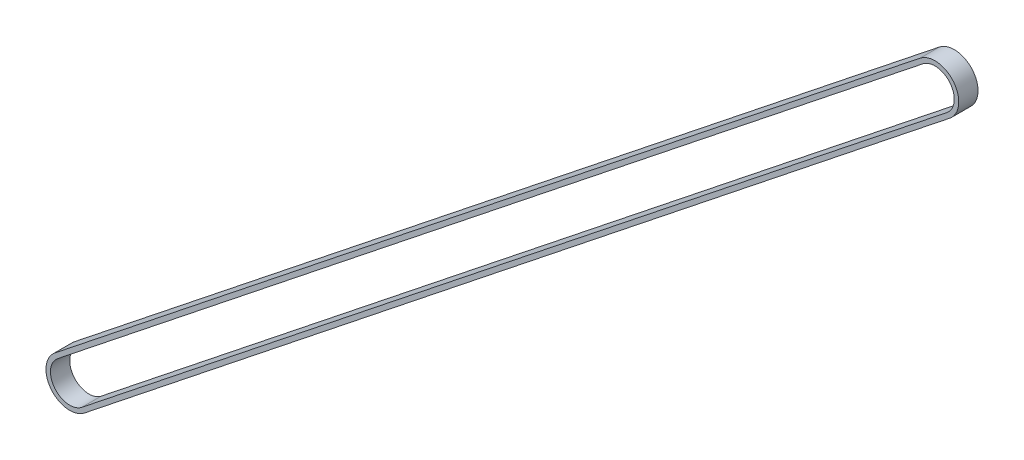
ISO-10303-21;
HEADER;
FILE_DESCRIPTION(('STEP AP214'),'2;1');
FILE_NAME('part.step','',(''),(''),'','','');
FILE_SCHEMA(('AUTOMOTIVE_DESIGN { 1 0 10303 214 1 1 1 1 }'));
ENDSEC;
DATA;
#1=APPLICATION_CONTEXT('core data for automotive mechanical design processes');
#2=APPLICATION_PROTOCOL_DEFINITION('international standard','automotive_design',2000,#1);
#3=PRODUCT_CONTEXT('',#1,'mechanical');
#4=PRODUCT('Part','Part','',(#3));
#5=PRODUCT_RELATED_PRODUCT_CATEGORY('part','',(#4));
#6=PRODUCT_DEFINITION_FORMATION('','',#4);
#7=PRODUCT_DEFINITION_CONTEXT('part definition',#1,'design');
#8=PRODUCT_DEFINITION('design','',#6,#7);
#9=PRODUCT_DEFINITION_SHAPE('','',#8);
#10=(LENGTH_UNIT() NAMED_UNIT(*) SI_UNIT(.MILLI.,.METRE.));
#11=(NAMED_UNIT(*) PLANE_ANGLE_UNIT() SI_UNIT($,.RADIAN.));
#12=(NAMED_UNIT(*) SI_UNIT($,.STERADIAN.) SOLID_ANGLE_UNIT());
#13=UNCERTAINTY_MEASURE_WITH_UNIT(LENGTH_MEASURE(1.E-05),#10,'distance_accuracy_value','');
#14=(GEOMETRIC_REPRESENTATION_CONTEXT(3) GLOBAL_UNCERTAINTY_ASSIGNED_CONTEXT((#13)) GLOBAL_UNIT_ASSIGNED_CONTEXT((#10,
#11,#12)) REPRESENTATION_CONTEXT('',''));
#15=CARTESIAN_POINT('',(0.,0.,0.));
#16=DIRECTION('',(0.,0.,1.));
#17=DIRECTION('',(1.,0.,0.));
#18=AXIS2_PLACEMENT_3D('',#15,#16,#17);
#19=CARTESIAN_POINT('',(134.590091012356,107.009282001347,6.));
#20=DIRECTION('',(0.,0.,1.));
#21=DIRECTION('',(1.,0.,0.));
#22=AXIS2_PLACEMENT_3D('',#19,#20,#21);
#23=PLANE('',#22);
#24=CARTESIAN_POINT('',(269.180159552767,214.018546135803,6.));
#25=DIRECTION('',(0.,0.,1.));
#26=DIRECTION('',(-0.622341826415832,0.782745585163792,0.));
#27=AXIS2_PLACEMENT_3D('',#24,#25,#26);
#28=CIRCLE('',#27,7.4);
#29=CARTESIAN_POINT('',(273.785489068245,208.22622880559,6.));
#30=VERTEX_POINT('',#29);
#31=CARTESIAN_POINT('',(264.57483003729,219.810863466014,6.));
#32=VERTEX_POINT('',#31);
#33=EDGE_CURVE('E11',#30,#32,#28,.T.);
#34=ORIENTED_EDGE('',*,*,#33,.T.);
#35=DIRECTION('',(-0.782745585163795,-0.622341826415828,0.));
#36=VECTOR('',#35,1.);
#37=CARTESIAN_POINT('',(-4.60532951547723,5.79231733021199,6.));
#38=LINE('',#37,#36);
#39=CARTESIAN_POINT('',(-4.60532951547723,5.79231733021199,6.));
#40=VERTEX_POINT('',#39);
#41=EDGE_CURVE('E20',#32,#40,#38,.T.);
#42=ORIENTED_EDGE('',*,*,#41,.T.);
#43=CARTESIAN_POINT('',(0.,0.,6.));
#44=DIRECTION('',(0.,0.,1.));
#45=DIRECTION('',(0.622341826415842,-0.782745585163783,0.));
#46=AXIS2_PLACEMENT_3D('',#43,#44,#45);
#47=CIRCLE('',#46,7.4);
#48=CARTESIAN_POINT('',(4.60532951547712,-5.7923173302121,6.));
#49=VERTEX_POINT('',#48);
#50=EDGE_CURVE('E51',#40,#49,#47,.T.);
#51=ORIENTED_EDGE('',*,*,#50,.T.);
#52=DIRECTION('',(0.782745585163795,0.622341826415827,0.));
#53=VECTOR('',#52,1.);
#54=CARTESIAN_POINT('',(273.785489068245,208.22622880559,6.));
#55=LINE('',#54,#53);
#56=EDGE_CURVE('E124',#49,#30,#55,.T.);
#57=ORIENTED_EDGE('',*,*,#56,.T.);
#58=EDGE_LOOP('',(#34,#42,#51,#57));
#59=FACE_BOUND('',#58,.T.);
#60=DIRECTION('',(0.782745585163795,0.622341826415827,0.));
#61=VECTOR('',#60,1.);
#62=CARTESIAN_POINT('',(198.151074324067,165.210387579558,6.));
#63=LINE('',#62,#61);
#64=CARTESIAN_POINT('',(-3.73405095849498,4.69647351098278,6.));
#65=VERTEX_POINT('',#64);
#66=CARTESIAN_POINT('',(265.446108594273,218.715019646785,6.));
#67=VERTEX_POINT('',#66);
#68=EDGE_CURVE('E105',#65,#67,#63,.T.);
#69=ORIENTED_EDGE('',*,*,#68,.T.);
#70=CARTESIAN_POINT('',(269.180159552767,214.018546135803,6.));
#71=DIRECTION('',(0.,0.,-1.));
#72=DIRECTION('',(0.62234182641583,-0.782745585163793,0.));
#73=AXIS2_PLACEMENT_3D('',#70,#71,#72);
#74=CIRCLE('',#73,6.);
#75=CARTESIAN_POINT('',(272.914210511262,209.322072624819,6.));
#76=VERTEX_POINT('',#75);
#77=EDGE_CURVE('E129',#67,#76,#74,.T.);
#78=ORIENTED_EDGE('',*,*,#77,.T.);
#79=DIRECTION('',(-0.782745585163795,-0.622341826415828,0.));
#80=VECTOR('',#79,1.);
#81=CARTESIAN_POINT('',(71.029096464673,48.8081674896907,6.));
#82=LINE('',#81,#80);
#83=CARTESIAN_POINT('',(3.73405095849504,-4.69647351098287,6.));
#84=VERTEX_POINT('',#83);
#85=EDGE_CURVE('E97',#76,#84,#82,.T.);
#86=ORIENTED_EDGE('',*,*,#85,.T.);
#87=CARTESIAN_POINT('',(0.,0.,6.));
#88=DIRECTION('',(0.,0.,-1.));
#89=DIRECTION('',(-0.622341826415828,0.782745585163795,0.));
#90=AXIS2_PLACEMENT_3D('',#87,#88,#89);
#91=CIRCLE('',#90,6.);
#92=EDGE_CURVE('E96',#84,#65,#91,.T.);
#93=ORIENTED_EDGE('',*,*,#92,.T.);
#94=EDGE_LOOP('',(#69,#78,#86,#93));
#95=FACE_BOUND('',#94,.T.);
#96=ADVANCED_FACE('F16',(#59,#95),#23,.T.);
#97=CARTESIAN_POINT('',(134.590091012356,107.009282001347,0.));
#98=DIRECTION('',(0.,0.,1.));
#99=DIRECTION('',(1.,0.,0.));
#100=AXIS2_PLACEMENT_3D('',#97,#98,#99);
#101=PLANE('',#100);
#102=CARTESIAN_POINT('',(269.180159552767,214.018546135803,0.));
#103=DIRECTION('',(0.,0.,-1.));
#104=DIRECTION('',(-0.622341826415832,0.782745585163792,0.));
#105=AXIS2_PLACEMENT_3D('',#102,#103,#104);
#106=CIRCLE('',#105,7.4);
#107=CARTESIAN_POINT('',(264.57483003729,219.810863466014,0.));
#108=VERTEX_POINT('',#107);
#109=CARTESIAN_POINT('',(273.785489068245,208.22622880559,0.));
#110=VERTEX_POINT('',#109);
#111=EDGE_CURVE('E27',#108,#110,#106,.T.);
#112=ORIENTED_EDGE('',*,*,#111,.T.);
#113=DIRECTION('',(-0.782745585163795,-0.622341826415827,0.));
#114=VECTOR('',#113,1.);
#115=CARTESIAN_POINT('',(273.785489068245,208.22622880559,0.));
#116=LINE('',#115,#114);
#117=CARTESIAN_POINT('',(4.60532951547712,-5.79231733021209,0.));
#118=VERTEX_POINT('',#117);
#119=EDGE_CURVE('E125',#110,#118,#116,.T.);
#120=ORIENTED_EDGE('',*,*,#119,.T.);
#121=CARTESIAN_POINT('',(0.,0.,0.));
#122=DIRECTION('',(0.,0.,-1.));
#123=DIRECTION('',(0.622341826415842,-0.782745585163783,0.));
#124=AXIS2_PLACEMENT_3D('',#121,#122,#123);
#125=CIRCLE('',#124,7.4);
#126=CARTESIAN_POINT('',(-4.60532951547723,5.792317330212,0.));
#127=VERTEX_POINT('',#126);
#128=EDGE_CURVE('E143',#118,#127,#125,.T.);
#129=ORIENTED_EDGE('',*,*,#128,.T.);
#130=DIRECTION('',(0.782745585163795,0.622341826415828,0.));
#131=VECTOR('',#130,1.);
#132=CARTESIAN_POINT('',(-4.60532951547723,5.79231733021199,0.));
#133=LINE('',#132,#131);
#134=EDGE_CURVE('E115',#127,#108,#133,.T.);
#135=ORIENTED_EDGE('',*,*,#134,.T.);
#136=EDGE_LOOP('',(#112,#120,#129,#135));
#137=FACE_BOUND('',#136,.T.);
#138=DIRECTION('',(-0.782745585163795,-0.622341826415827,0.));
#139=VECTOR('',#138,1.);
#140=CARTESIAN_POINT('',(198.151074324067,165.210387579558,0.));
#141=LINE('',#140,#139);
#142=CARTESIAN_POINT('',(265.446108594273,218.715019646785,0.));
#143=VERTEX_POINT('',#142);
#144=CARTESIAN_POINT('',(-3.73405095849498,4.69647351098278,0.));
#145=VERTEX_POINT('',#144);
#146=EDGE_CURVE('E103',#143,#145,#141,.T.);
#147=ORIENTED_EDGE('',*,*,#146,.T.);
#148=CARTESIAN_POINT('',(0.,0.,0.));
#149=DIRECTION('',(0.,0.,1.));
#150=DIRECTION('',(-0.622341826415828,0.782745585163795,0.));
#151=AXIS2_PLACEMENT_3D('',#148,#149,#150);
#152=CIRCLE('',#151,6.);
#153=CARTESIAN_POINT('',(3.73405095849504,-4.69647351098287,0.));
#154=VERTEX_POINT('',#153);
#155=EDGE_CURVE('E88',#145,#154,#152,.T.);
#156=ORIENTED_EDGE('',*,*,#155,.T.);
#157=DIRECTION('',(0.782745585163795,0.622341826415828,0.));
#158=VECTOR('',#157,1.);
#159=CARTESIAN_POINT('',(71.029096464673,48.8081674896907,0.));
#160=LINE('',#159,#158);
#161=CARTESIAN_POINT('',(272.914210511262,209.322072624819,0.));
#162=VERTEX_POINT('',#161);
#163=EDGE_CURVE('E138',#154,#162,#160,.T.);
#164=ORIENTED_EDGE('',*,*,#163,.T.);
#165=CARTESIAN_POINT('',(269.180159552767,214.018546135803,0.));
#166=DIRECTION('',(0.,0.,1.));
#167=DIRECTION('',(0.62234182641583,-0.782745585163793,0.));
#168=AXIS2_PLACEMENT_3D('',#165,#166,#167);
#169=CIRCLE('',#168,6.);
#170=EDGE_CURVE('E81',#162,#143,#169,.T.);
#171=ORIENTED_EDGE('',*,*,#170,.T.);
#172=EDGE_LOOP('',(#147,#156,#164,#171));
#173=FACE_BOUND('',#172,.T.);
#174=ADVANCED_FACE('F108',(#137,#173),#101,.F.);
#175=CARTESIAN_POINT('',(269.180159552767,214.018546135803,0.));
#176=DIRECTION('',(0.,0.,-1.));
#177=DIRECTION('',(-0.622341826415832,0.782745585163792,0.));
#178=AXIS2_PLACEMENT_3D('',#175,#176,#177);
#179=CYLINDRICAL_SURFACE('',#178,7.4);
#180=ORIENTED_EDGE('',*,*,#111,.F.);
#181=DIRECTION('',(0.,0.,1.));
#182=VECTOR('',#181,1.);
#183=CARTESIAN_POINT('',(264.57483003729,219.810863466014,0.));
#184=LINE('',#183,#182);
#185=EDGE_CURVE('E141',#108,#32,#184,.T.);
#186=ORIENTED_EDGE('',*,*,#185,.T.);
#187=ORIENTED_EDGE('',*,*,#33,.F.);
#188=DIRECTION('',(0.,0.,1.));
#189=VECTOR('',#188,1.);
#190=CARTESIAN_POINT('',(273.785489068245,208.22622880559,0.));
#191=LINE('',#190,#189);
#192=EDGE_CURVE('E120',#110,#30,#191,.T.);
#193=ORIENTED_EDGE('',*,*,#192,.F.);
#194=EDGE_LOOP('',(#180,#186,#187,#193));
#195=FACE_BOUND('',#194,.T.);
#196=ADVANCED_FACE('F192',(#195),#179,.T.);
#197=CARTESIAN_POINT('',(264.57483003729,219.810863466014,0.));
#198=DIRECTION('',(-0.622341826415827,0.782745585163795,0.));
#199=DIRECTION('',(-0.782745585163795,-0.622341826415827,0.));
#200=AXIS2_PLACEMENT_3D('',#197,#198,#199);
#201=PLANE('',#200);
#202=ORIENTED_EDGE('',*,*,#134,.F.);
#203=DIRECTION('',(0.,0.,1.));
#204=VECTOR('',#203,1.);
#205=CARTESIAN_POINT('',(-4.60532951547723,5.792317330212,0.));
#206=LINE('',#205,#204);
#207=EDGE_CURVE('E119',#127,#40,#206,.T.);
#208=ORIENTED_EDGE('',*,*,#207,.T.);
#209=ORIENTED_EDGE('',*,*,#41,.F.);
#210=ORIENTED_EDGE('',*,*,#185,.F.);
#211=EDGE_LOOP('',(#202,#208,#209,#210));
#212=FACE_BOUND('',#211,.T.);
#213=ADVANCED_FACE('F189',(#212),#201,.T.);
#214=CARTESIAN_POINT('',(0.,0.,0.));
#215=DIRECTION('',(0.,0.,-1.));
#216=DIRECTION('',(0.622341826415842,-0.782745585163784,0.));
#217=AXIS2_PLACEMENT_3D('',#214,#215,#216);
#218=CYLINDRICAL_SURFACE('',#217,7.4);
#219=ORIENTED_EDGE('',*,*,#128,.F.);
#220=DIRECTION('',(0.,0.,1.));
#221=VECTOR('',#220,1.);
#222=CARTESIAN_POINT('',(4.60532951547712,-5.79231733021209,0.));
#223=LINE('',#222,#221);
#224=EDGE_CURVE('E134',#118,#49,#223,.T.);
#225=ORIENTED_EDGE('',*,*,#224,.T.);
#226=ORIENTED_EDGE('',*,*,#50,.F.);
#227=ORIENTED_EDGE('',*,*,#207,.F.);
#228=EDGE_LOOP('',(#219,#225,#226,#227));
#229=FACE_BOUND('',#228,.T.);
#230=ADVANCED_FACE('F167',(#229),#218,.T.);
#231=CARTESIAN_POINT('',(4.60532951547712,-5.7923173302121,0.));
#232=DIRECTION('',(0.622341826415827,-0.782745585163795,0.));
#233=DIRECTION('',(0.782745585163795,0.622341826415827,0.));
#234=AXIS2_PLACEMENT_3D('',#231,#232,#233);
#235=PLANE('',#234);
#236=ORIENTED_EDGE('',*,*,#119,.F.);
#237=ORIENTED_EDGE('',*,*,#192,.T.);
#238=ORIENTED_EDGE('',*,*,#56,.F.);
#239=ORIENTED_EDGE('',*,*,#224,.F.);
#240=EDGE_LOOP('',(#236,#237,#238,#239));
#241=FACE_BOUND('',#240,.T.);
#242=ADVANCED_FACE('F171',(#241),#235,.T.);
#243=CARTESIAN_POINT('',(0.,0.,0.));
#244=DIRECTION('',(0.,0.,-1.));
#245=DIRECTION('',(-0.622341826415828,0.782745585163795,0.));
#246=AXIS2_PLACEMENT_3D('',#243,#244,#245);
#247=CYLINDRICAL_SURFACE('',#246,6.);
#248=ORIENTED_EDGE('',*,*,#155,.F.);
#249=DIRECTION('',(0.,0.,1.));
#250=VECTOR('',#249,1.);
#251=CARTESIAN_POINT('',(-3.73405095849498,4.69647351098278,0.));
#252=LINE('',#251,#250);
#253=EDGE_CURVE('E91',#145,#65,#252,.T.);
#254=ORIENTED_EDGE('',*,*,#253,.T.);
#255=ORIENTED_EDGE('',*,*,#92,.F.);
#256=DIRECTION('',(0.,0.,1.));
#257=VECTOR('',#256,1.);
#258=CARTESIAN_POINT('',(3.73405095849504,-4.69647351098287,0.));
#259=LINE('',#258,#257);
#260=EDGE_CURVE('E94',#154,#84,#259,.T.);
#261=ORIENTED_EDGE('',*,*,#260,.F.);
#262=EDGE_LOOP('',(#248,#254,#255,#261));
#263=FACE_BOUND('',#262,.T.);
#264=ADVANCED_FACE('F90',(#263),#247,.F.);
#265=CARTESIAN_POINT('',(3.73405095849502,-4.69647351098285,0.));
#266=DIRECTION('',(0.622341826415827,-0.782745585163795,0.));
#267=DIRECTION('',(0.782745585163795,0.622341826415827,0.));
#268=AXIS2_PLACEMENT_3D('',#265,#266,#267);
#269=PLANE('',#268);
#270=ORIENTED_EDGE('',*,*,#163,.F.);
#271=ORIENTED_EDGE('',*,*,#260,.T.);
#272=ORIENTED_EDGE('',*,*,#85,.F.);
#273=DIRECTION('',(0.,0.,1.));
#274=VECTOR('',#273,1.);
#275=CARTESIAN_POINT('',(272.914210511262,209.322072624819,0.));
#276=LINE('',#275,#274);
#277=EDGE_CURVE('E126',#162,#76,#276,.T.);
#278=ORIENTED_EDGE('',*,*,#277,.F.);
#279=EDGE_LOOP('',(#270,#271,#272,#278));
#280=FACE_BOUND('',#279,.T.);
#281=ADVANCED_FACE('F178',(#280),#269,.F.);
#282=CARTESIAN_POINT('',(269.180159552767,214.018546135803,0.));
#283=DIRECTION('',(0.,0.,-1.));
#284=DIRECTION('',(0.62234182641583,-0.782745585163793,0.));
#285=AXIS2_PLACEMENT_3D('',#282,#283,#284);
#286=CYLINDRICAL_SURFACE('',#285,6.);
#287=ORIENTED_EDGE('',*,*,#170,.F.);
#288=ORIENTED_EDGE('',*,*,#277,.T.);
#289=ORIENTED_EDGE('',*,*,#77,.F.);
#290=DIRECTION('',(0.,0.,1.));
#291=VECTOR('',#290,1.);
#292=CARTESIAN_POINT('',(265.446108594273,218.715019646785,0.));
#293=LINE('',#292,#291);
#294=EDGE_CURVE('E109',#143,#67,#293,.T.);
#295=ORIENTED_EDGE('',*,*,#294,.F.);
#296=EDGE_LOOP('',(#287,#288,#289,#295));
#297=FACE_BOUND('',#296,.T.);
#298=ADVANCED_FACE('F18',(#297),#286,.F.);
#299=CARTESIAN_POINT('',(265.446108594273,218.715019646785,0.));
#300=DIRECTION('',(-0.622341826415827,0.782745585163795,0.));
#301=DIRECTION('',(-0.782745585163795,-0.622341826415827,0.));
#302=AXIS2_PLACEMENT_3D('',#299,#300,#301);
#303=PLANE('',#302);
#304=ORIENTED_EDGE('',*,*,#146,.F.);
#305=ORIENTED_EDGE('',*,*,#294,.T.);
#306=ORIENTED_EDGE('',*,*,#68,.F.);
#307=ORIENTED_EDGE('',*,*,#253,.F.);
#308=EDGE_LOOP('',(#304,#305,#306,#307));
#309=FACE_BOUND('',#308,.T.);
#310=ADVANCED_FACE('F101',(#309),#303,.F.);
#311=CLOSED_SHELL('',(#96,#174,#196,#213,#230,#242,#264,#281,#298,#310));
#312=MANIFOLD_SOLID_BREP('B1',#311);
#313=ADVANCED_BREP_SHAPE_REPRESENTATION('',(#18,#312),#14);
#314=SHAPE_DEFINITION_REPRESENTATION(#9,#313);
ENDSEC;
END-ISO-10303-21;
